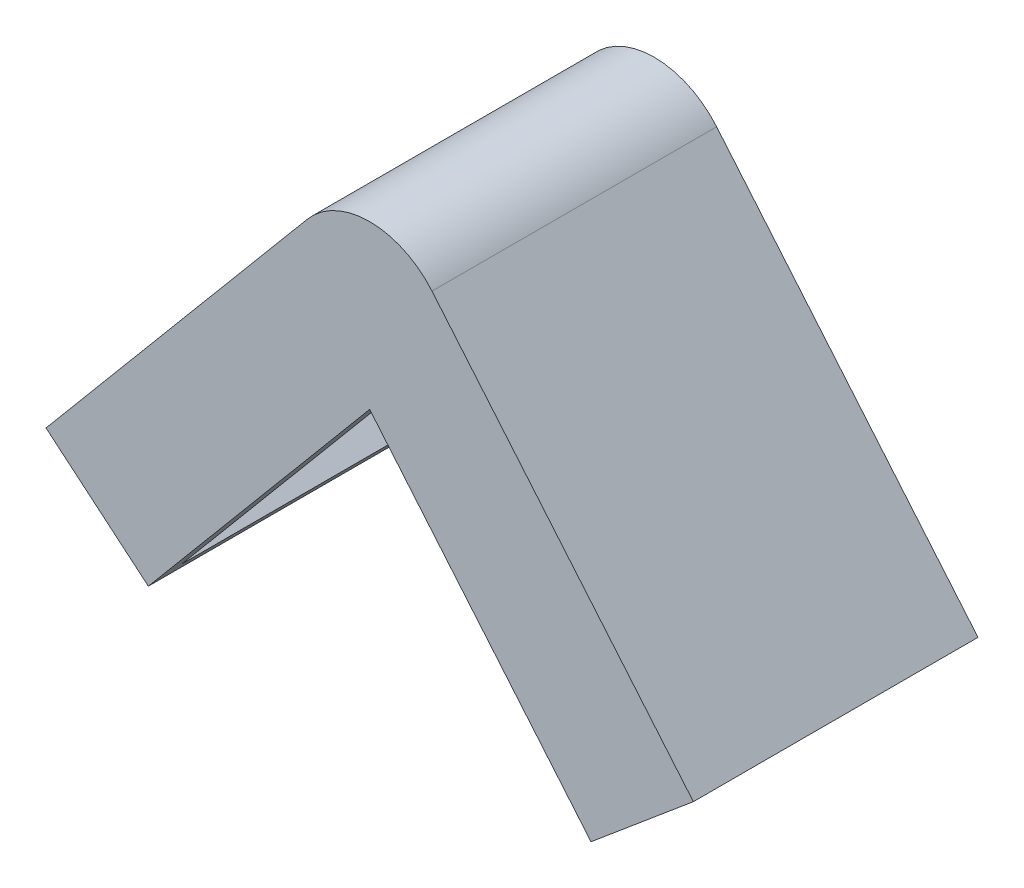
ISO-10303-21;
HEADER;
FILE_DESCRIPTION(('STEP AP214'),'2;1');
FILE_NAME('part.step','',(''),(''),'','','');
FILE_SCHEMA(('AUTOMOTIVE_DESIGN { 1 0 10303 214 1 1 1 1 }'));
ENDSEC;
DATA;
#1=APPLICATION_CONTEXT('core data for automotive mechanical design processes');
#2=APPLICATION_PROTOCOL_DEFINITION('international standard','automotive_design',2000,#1);
#3=PRODUCT_CONTEXT('',#1,'mechanical');
#4=PRODUCT('Part','Part','',(#3));
#5=PRODUCT_RELATED_PRODUCT_CATEGORY('part','',(#4));
#6=PRODUCT_DEFINITION_FORMATION('','',#4);
#7=PRODUCT_DEFINITION_CONTEXT('part definition',#1,'design');
#8=PRODUCT_DEFINITION('design','',#6,#7);
#9=PRODUCT_DEFINITION_SHAPE('','',#8);
#10=(LENGTH_UNIT() NAMED_UNIT(*) SI_UNIT(.MILLI.,.METRE.));
#11=(NAMED_UNIT(*) PLANE_ANGLE_UNIT() SI_UNIT($,.RADIAN.));
#12=(NAMED_UNIT(*) SI_UNIT($,.STERADIAN.) SOLID_ANGLE_UNIT());
#13=UNCERTAINTY_MEASURE_WITH_UNIT(LENGTH_MEASURE(1.E-05),#10,'distance_accuracy_value','');
#14=(GEOMETRIC_REPRESENTATION_CONTEXT(3) GLOBAL_UNCERTAINTY_ASSIGNED_CONTEXT((#13)) GLOBAL_UNIT_ASSIGNED_CONTEXT((#10,
#11,#12)) REPRESENTATION_CONTEXT('',''));
#15=CARTESIAN_POINT('',(0.,0.,0.));
#16=DIRECTION('',(0.,0.,1.));
#17=DIRECTION('',(1.,0.,0.));
#18=AXIS2_PLACEMENT_3D('',#15,#16,#17);
#19=CARTESIAN_POINT('',(0.,0.,88.9));
#20=DIRECTION('',(0.,0.,-1.));
#21=DIRECTION('',(-1.,0.,0.));
#22=AXIS2_PLACEMENT_3D('',#19,#20,#21);
#23=CYLINDRICAL_SURFACE('',#22,25.4);
#24=CARTESIAN_POINT('',(0.,0.,0.));
#25=DIRECTION('',(0.,0.,1.));
#26=DIRECTION('',(1.,0.,0.));
#27=AXIS2_PLACEMENT_3D('',#24,#25,#26);
#28=CIRCLE('',#27,25.4);
#29=CARTESIAN_POINT('',(19.4575288552219,16.3268052860382,0.));
#30=VERTEX_POINT('',#29);
#31=CARTESIAN_POINT('',(-19.4575288552221,16.3268052860381,0.));
#32=VERTEX_POINT('',#31);
#33=EDGE_CURVE('E137',#30,#32,#28,.T.);
#34=ORIENTED_EDGE('',*,*,#33,.T.);
#35=DIRECTION('',(0.,0.,-1.));
#36=VECTOR('',#35,1.);
#37=CARTESIAN_POINT('',(-19.4575288552221,16.3268052860381,88.9));
#38=LINE('',#37,#36);
#39=CARTESIAN_POINT('',(-19.4575288552221,16.3268052860381,88.9));
#40=VERTEX_POINT('',#39);
#41=EDGE_CURVE('E163',#40,#32,#38,.T.);
#42=ORIENTED_EDGE('',*,*,#41,.F.);
#43=CARTESIAN_POINT('',(0.,0.,88.9));
#44=DIRECTION('',(0.,0.,1.));
#45=DIRECTION('',(1.,0.,0.));
#46=AXIS2_PLACEMENT_3D('',#43,#44,#45);
#47=CIRCLE('',#46,25.4);
#48=CARTESIAN_POINT('',(19.4575288552219,16.3268052860382,88.9));
#49=VERTEX_POINT('',#48);
#50=EDGE_CURVE('E154',#49,#40,#47,.T.);
#51=ORIENTED_EDGE('',*,*,#50,.F.);
#52=DIRECTION('',(0.,0.,-1.));
#53=VECTOR('',#52,1.);
#54=CARTESIAN_POINT('',(19.4575288552219,16.3268052860382,88.9));
#55=LINE('',#54,#53);
#56=EDGE_CURVE('E57',#49,#30,#55,.T.);
#57=ORIENTED_EDGE('',*,*,#56,.T.);
#58=EDGE_LOOP('',(#34,#42,#51,#57));
#59=FACE_BOUND('',#58,.T.);
#60=ADVANCED_FACE('F35',(#59),#23,.T.);
#61=CARTESIAN_POINT('',(-19.4575288552221,16.3268052860381,88.9));
#62=DIRECTION('',(0.766044443118979,-0.642787609686538,0.));
#63=DIRECTION('',(0.642787609686538,0.766044443118979,0.));
#64=AXIS2_PLACEMENT_3D('',#61,#62,#63);
#65=PLANE('',#64);
#66=DIRECTION('',(-0.642787609686538,-0.766044443118979,0.));
#67=VECTOR('',#66,1.);
#68=CARTESIAN_POINT('',(-19.4575288552221,16.3268052860381,0.));
#69=LINE('',#68,#67);
#70=CARTESIAN_POINT('',(-101.091555285412,-80.9608389900723,0.));
#71=VERTEX_POINT('',#70);
#72=EDGE_CURVE('E139',#32,#71,#69,.T.);
#73=ORIENTED_EDGE('',*,*,#72,.T.);
#74=DIRECTION('',(0.,0.,-1.));
#75=VECTOR('',#74,1.);
#76=CARTESIAN_POINT('',(-101.091555285412,-80.9608389900723,88.9));
#77=LINE('',#76,#75);
#78=CARTESIAN_POINT('',(-101.091555285412,-80.9608389900723,88.9));
#79=VERTEX_POINT('',#78);
#80=EDGE_CURVE('E160',#79,#71,#77,.T.);
#81=ORIENTED_EDGE('',*,*,#80,.F.);
#82=DIRECTION('',(-0.642787609686538,-0.766044443118979,0.));
#83=VECTOR('',#82,1.);
#84=CARTESIAN_POINT('',(-19.4575288552221,16.3268052860381,88.9));
#85=LINE('',#84,#83);
#86=EDGE_CURVE('E94',#40,#79,#85,.T.);
#87=ORIENTED_EDGE('',*,*,#86,.F.);
#88=ORIENTED_EDGE('',*,*,#41,.T.);
#89=EDGE_LOOP('',(#73,#81,#87,#88));
#90=FACE_BOUND('',#89,.T.);
#91=ADVANCED_FACE('F222',(#90),#65,.F.);
#92=CARTESIAN_POINT('',(-81.6340264301902,-97.2876442761104,88.9));
#93=DIRECTION('',(0.642787609686537,0.76604444311898,0.));
#94=DIRECTION('',(-0.76604444311898,0.642787609686537,0.));
#95=AXIS2_PLACEMENT_3D('',#92,#93,#94);
#96=PLANE('',#95);
#97=DIRECTION('',(0.76604444311898,-0.642787609686537,0.));
#98=VECTOR('',#97,1.);
#99=CARTESIAN_POINT('',(-81.6340264301902,-97.2876442761104,0.));
#100=LINE('',#99,#98);
#101=CARTESIAN_POINT('',(-69.1269679669352,-107.78231241974,0.));
#102=VERTEX_POINT('',#101);
#103=EDGE_CURVE('E142',#71,#102,#100,.T.);
#104=ORIENTED_EDGE('',*,*,#103,.T.);
#105=DIRECTION('',(0.,0.,-1.));
#106=VECTOR('',#105,1.);
#107=CARTESIAN_POINT('',(-69.1269679669352,-107.78231241974,88.9));
#108=LINE('',#107,#106);
#109=CARTESIAN_POINT('',(-69.1269679669352,-107.78231241974,88.9));
#110=VERTEX_POINT('',#109);
#111=EDGE_CURVE('E158',#110,#102,#108,.T.);
#112=ORIENTED_EDGE('',*,*,#111,.F.);
#113=DIRECTION('',(0.76604444311898,-0.642787609686537,0.));
#114=VECTOR('',#113,1.);
#115=CARTESIAN_POINT('',(-81.6340264301902,-97.2876442761104,88.9));
#116=LINE('',#115,#114);
#117=EDGE_CURVE('E214',#79,#110,#116,.T.);
#118=ORIENTED_EDGE('',*,*,#117,.F.);
#119=ORIENTED_EDGE('',*,*,#80,.T.);
#120=EDGE_LOOP('',(#104,#112,#118,#119));
#121=FACE_BOUND('',#120,.T.);
#122=ADVANCED_FACE('F225',(#121),#96,.F.);
#123=CARTESIAN_POINT('',(12.507058463255,-10.4946681436299,88.9));
#124=DIRECTION('',(0.766044443118979,-0.642787609686538,0.));
#125=DIRECTION('',(0.642787609686538,0.76604444311898,0.));
#126=AXIS2_PLACEMENT_3D('',#123,#124,#125);
#127=PLANE('',#126);
#128=DIRECTION('',(0.,0.,-1.));
#129=VECTOR('',#128,1.);
#130=CARTESIAN_POINT('',(-65.0452666454257,-102.917930205935,88.9));
#131=LINE('',#130,#129);
#132=CARTESIAN_POINT('',(-65.0452666454257,-102.917930205935,82.55));
#133=VERTEX_POINT('',#132);
#134=CARTESIAN_POINT('',(-65.0452666454257,-102.917930205935,6.34999999999999));
#135=VERTEX_POINT('',#134);
#136=EDGE_CURVE('E11',#133,#135,#131,.T.);
#137=ORIENTED_EDGE('',*,*,#136,.F.);
#138=DIRECTION('',(-0.642787609686538,-0.766044443118979,0.));
#139=VECTOR('',#138,1.);
#140=CARTESIAN_POINT('',(12.507058463255,-10.4946681436299,82.55));
#141=LINE('',#140,#139);
#142=CARTESIAN_POINT('',(-4.08170132150951,-30.2643822138055,82.55));
#143=VERTEX_POINT('',#142);
#144=EDGE_CURVE('E42',#143,#133,#141,.T.);
#145=ORIENTED_EDGE('',*,*,#144,.F.);
#146=DIRECTION('',(0.,0.,1.));
#147=VECTOR('',#146,1.);
#148=CARTESIAN_POINT('',(-4.08170132150951,-30.2643822138055,88.9));
#149=LINE('',#148,#147);
#150=CARTESIAN_POINT('',(-4.08170132150951,-30.2643822138055,6.34999999999999));
#151=VERTEX_POINT('',#150);
#152=EDGE_CURVE('E167',#151,#143,#149,.T.);
#153=ORIENTED_EDGE('',*,*,#152,.F.);
#154=DIRECTION('',(0.642787609686538,0.766044443118979,0.));
#155=VECTOR('',#154,1.);
#156=CARTESIAN_POINT('',(12.507058463255,-10.4946681436299,6.34999999999999));
#157=LINE('',#156,#155);
#158=EDGE_CURVE('E165',#135,#151,#157,.T.);
#159=ORIENTED_EDGE('',*,*,#158,.F.);
#160=EDGE_LOOP('',(#137,#145,#153,#159));
#161=FACE_BOUND('',#160,.T.);
#162=DIRECTION('',(-0.642787609686538,-0.76604444311898,0.));
#163=VECTOR('',#162,1.);
#164=CARTESIAN_POINT('',(12.507058463255,-10.4946681436299,0.));
#165=LINE('',#164,#163);
#166=CARTESIAN_POINT('',(0.,-25.4,0.));
#167=VERTEX_POINT('',#166);
#168=EDGE_CURVE('E145',#167,#102,#165,.T.);
#169=ORIENTED_EDGE('',*,*,#168,.F.);
#170=DIRECTION('',(0.,0.,-1.));
#171=VECTOR('',#170,1.);
#172=CARTESIAN_POINT('',(0.,-25.4,88.9));
#173=LINE('',#172,#171);
#174=CARTESIAN_POINT('',(0.,-25.4,88.9));
#175=VERTEX_POINT('',#174);
#176=EDGE_CURVE('E128',#175,#167,#173,.T.);
#177=ORIENTED_EDGE('',*,*,#176,.F.);
#178=DIRECTION('',(-0.642787609686538,-0.76604444311898,0.));
#179=VECTOR('',#178,1.);
#180=CARTESIAN_POINT('',(12.507058463255,-10.4946681436299,88.9));
#181=LINE('',#180,#179);
#182=EDGE_CURVE('E117',#175,#110,#181,.T.);
#183=ORIENTED_EDGE('',*,*,#182,.T.);
#184=ORIENTED_EDGE('',*,*,#111,.T.);
#185=EDGE_LOOP('',(#169,#177,#183,#184));
#186=FACE_BOUND('',#185,.T.);
#187=ADVANCED_FACE('F192',(#161,#186),#127,.T.);
#188=CARTESIAN_POINT('',(-12.5070584632551,-10.4946681436301,88.9));
#189=DIRECTION('',(0.766044443118974,0.642787609686544,0.));
#190=DIRECTION('',(-0.642787609686544,0.766044443118974,0.));
#191=AXIS2_PLACEMENT_3D('',#188,#189,#190);
#192=PLANE('',#191);
#193=DIRECTION('',(0.642787609686544,-0.766044443118974,0.));
#194=VECTOR('',#193,1.);
#195=CARTESIAN_POINT('',(-12.5070584632551,-10.4946681436301,0.));
#196=LINE('',#195,#194);
#197=CARTESIAN_POINT('',(69.1269679669359,-107.78231241974,0.));
#198=VERTEX_POINT('',#197);
#199=EDGE_CURVE('E124',#167,#198,#196,.T.);
#200=ORIENTED_EDGE('',*,*,#199,.T.);
#201=DIRECTION('',(0.,0.,-1.));
#202=VECTOR('',#201,1.);
#203=CARTESIAN_POINT('',(69.1269679669359,-107.78231241974,88.9));
#204=LINE('',#203,#202);
#205=CARTESIAN_POINT('',(69.1269679669359,-107.78231241974,88.9));
#206=VERTEX_POINT('',#205);
#207=EDGE_CURVE('E121',#206,#198,#204,.T.);
#208=ORIENTED_EDGE('',*,*,#207,.F.);
#209=DIRECTION('',(0.642787609686544,-0.766044443118974,0.));
#210=VECTOR('',#209,1.);
#211=CARTESIAN_POINT('',(-12.5070584632551,-10.4946681436301,88.9));
#212=LINE('',#211,#210);
#213=EDGE_CURVE('E109',#175,#206,#212,.T.);
#214=ORIENTED_EDGE('',*,*,#213,.F.);
#215=ORIENTED_EDGE('',*,*,#176,.T.);
#216=EDGE_LOOP('',(#200,#208,#214,#215));
#217=FACE_BOUND('',#216,.T.);
#218=ADVANCED_FACE('F122',(#217),#192,.F.);
#219=CARTESIAN_POINT('',(81.6340264301906,-97.28764427611,88.9));
#220=DIRECTION('',(-0.642787609686541,0.766044443118977,0.));
#221=DIRECTION('',(-0.766044443118977,-0.642787609686541,0.));
#222=AXIS2_PLACEMENT_3D('',#219,#220,#221);
#223=PLANE('',#222);
#224=DIRECTION('',(0.766044443118977,0.642787609686541,0.));
#225=VECTOR('',#224,1.);
#226=CARTESIAN_POINT('',(81.6340264301906,-97.28764427611,0.));
#227=LINE('',#226,#225);
#228=CARTESIAN_POINT('',(101.091555285413,-80.9608389900715,0.));
#229=VERTEX_POINT('',#228);
#230=EDGE_CURVE('E149',#198,#229,#227,.T.);
#231=ORIENTED_EDGE('',*,*,#230,.T.);
#232=DIRECTION('',(0.,0.,-1.));
#233=VECTOR('',#232,1.);
#234=CARTESIAN_POINT('',(101.091555285413,-80.9608389900715,88.9));
#235=LINE('',#234,#233);
#236=CARTESIAN_POINT('',(101.091555285413,-80.9608389900715,88.9));
#237=VERTEX_POINT('',#236);
#238=EDGE_CURVE('E129',#237,#229,#235,.T.);
#239=ORIENTED_EDGE('',*,*,#238,.F.);
#240=DIRECTION('',(0.766044443118977,0.642787609686541,0.));
#241=VECTOR('',#240,1.);
#242=CARTESIAN_POINT('',(81.6340264301906,-97.28764427611,88.9));
#243=LINE('',#242,#241);
#244=EDGE_CURVE('E114',#206,#237,#243,.T.);
#245=ORIENTED_EDGE('',*,*,#244,.F.);
#246=ORIENTED_EDGE('',*,*,#207,.T.);
#247=EDGE_LOOP('',(#231,#239,#245,#246));
#248=FACE_BOUND('',#247,.T.);
#249=ADVANCED_FACE('F131',(#248),#223,.F.);
#250=CARTESIAN_POINT('',(19.4575288552219,16.3268052860382,88.9));
#251=DIRECTION('',(0.766044443118974,0.642787609686544,0.));
#252=DIRECTION('',(-0.642787609686544,0.766044443118974,0.));
#253=AXIS2_PLACEMENT_3D('',#250,#251,#252);
#254=PLANE('',#253);
#255=DIRECTION('',(0.642787609686544,-0.766044443118974,0.));
#256=VECTOR('',#255,1.);
#257=CARTESIAN_POINT('',(19.4575288552219,16.3268052860382,0.));
#258=LINE('',#257,#256);
#259=EDGE_CURVE('E151',#30,#229,#258,.T.);
#260=ORIENTED_EDGE('',*,*,#259,.F.);
#261=ORIENTED_EDGE('',*,*,#56,.F.);
#262=DIRECTION('',(0.642787609686544,-0.766044443118974,0.));
#263=VECTOR('',#262,1.);
#264=CARTESIAN_POINT('',(19.4575288552219,16.3268052860382,88.9));
#265=LINE('',#264,#263);
#266=EDGE_CURVE('E132',#49,#237,#265,.T.);
#267=ORIENTED_EDGE('',*,*,#266,.T.);
#268=ORIENTED_EDGE('',*,*,#238,.T.);
#269=EDGE_LOOP('',(#260,#261,#267,#268));
#270=FACE_BOUND('',#269,.T.);
#271=ADVANCED_FACE('F220',(#270),#254,.T.);
#272=CARTESIAN_POINT('',(0.,0.,88.9));
#273=DIRECTION('',(0.,0.,1.));
#274=DIRECTION('',(1.,0.,0.));
#275=AXIS2_PLACEMENT_3D('',#272,#273,#274);
#276=PLANE('',#275);
#277=ORIENTED_EDGE('',*,*,#50,.T.);
#278=ORIENTED_EDGE('',*,*,#86,.T.);
#279=ORIENTED_EDGE('',*,*,#117,.T.);
#280=ORIENTED_EDGE('',*,*,#182,.F.);
#281=ORIENTED_EDGE('',*,*,#213,.T.);
#282=ORIENTED_EDGE('',*,*,#244,.T.);
#283=ORIENTED_EDGE('',*,*,#266,.F.);
#284=EDGE_LOOP('',(#277,#278,#279,#280,#281,#282,#283));
#285=FACE_BOUND('',#284,.T.);
#286=ADVANCED_FACE('F111',(#285),#276,.T.);
#287=CARTESIAN_POINT('',(0.,0.,0.));
#288=DIRECTION('',(0.,0.,1.));
#289=DIRECTION('',(1.,0.,0.));
#290=AXIS2_PLACEMENT_3D('',#287,#288,#289);
#291=PLANE('',#290);
#292=ORIENTED_EDGE('',*,*,#33,.F.);
#293=ORIENTED_EDGE('',*,*,#259,.T.);
#294=ORIENTED_EDGE('',*,*,#230,.F.);
#295=ORIENTED_EDGE('',*,*,#199,.F.);
#296=ORIENTED_EDGE('',*,*,#168,.T.);
#297=ORIENTED_EDGE('',*,*,#103,.F.);
#298=ORIENTED_EDGE('',*,*,#72,.F.);
#299=EDGE_LOOP('',(#292,#293,#294,#295,#296,#297,#298));
#300=FACE_BOUND('',#299,.T.);
#301=ADVANCED_FACE('F218',(#300),#291,.F.);
#302=CARTESIAN_POINT('',(-93.0641081969456,-79.4073305940399,6.34999999999999));
#303=DIRECTION('',(-0.642787609686538,-0.766044443118979,0.));
#304=DIRECTION('',(0.766044443118979,-0.642787609686538,0.));
#305=AXIS2_PLACEMENT_3D('',#302,#303,#304);
#306=PLANE('',#305);
#307=ORIENTED_EDGE('',*,*,#136,.T.);
#308=DIRECTION('',(0.766044443118979,-0.642787609686538,0.));
#309=VECTOR('',#308,1.);
#310=CARTESIAN_POINT('',(-93.0641081969456,-79.4073305940399,6.34999999999999));
#311=LINE('',#310,#309);
#312=CARTESIAN_POINT('',(-93.0641081969456,-79.4073305940399,6.34999999999999));
#313=VERTEX_POINT('',#312);
#314=EDGE_CURVE('E49',#313,#135,#311,.T.);
#315=ORIENTED_EDGE('',*,*,#314,.F.);
#316=DIRECTION('',(0.,0.,-1.));
#317=VECTOR('',#316,1.);
#318=CARTESIAN_POINT('',(-93.0641081969456,-79.4073305940399,6.34999999999999));
#319=LINE('',#318,#317);
#320=CARTESIAN_POINT('',(-93.0641081969456,-79.4073305940399,82.55));
#321=VERTEX_POINT('',#320);
#322=EDGE_CURVE('E189',#321,#313,#319,.T.);
#323=ORIENTED_EDGE('',*,*,#322,.F.);
#324=DIRECTION('',(0.766044443118979,-0.642787609686538,0.));
#325=VECTOR('',#324,1.);
#326=CARTESIAN_POINT('',(-93.0641081969456,-79.4073305940399,82.55));
#327=LINE('',#326,#325);
#328=EDGE_CURVE('E140',#321,#133,#327,.T.);
#329=ORIENTED_EDGE('',*,*,#328,.T.);
#330=EDGE_LOOP('',(#307,#315,#323,#329));
#331=FACE_BOUND('',#330,.T.);
#332=ADVANCED_FACE('F186',(#331),#306,.F.);
#333=CARTESIAN_POINT('',(-93.0641081969456,-79.4073305940399,82.55));
#334=DIRECTION('',(0.,0.,1.));
#335=DIRECTION('',(1.,0.,0.));
#336=AXIS2_PLACEMENT_3D('',#333,#334,#335);
#337=PLANE('',#336);
#338=ORIENTED_EDGE('',*,*,#144,.T.);
#339=ORIENTED_EDGE('',*,*,#328,.F.);
#340=DIRECTION('',(-0.642787609686538,-0.766044443118979,0.));
#341=VECTOR('',#340,1.);
#342=CARTESIAN_POINT('',(-93.0641081969456,-79.4073305940399,82.55));
#343=LINE('',#342,#341);
#344=CARTESIAN_POINT('',(-32.1005428730293,-6.75378260191069,82.55));
#345=VERTEX_POINT('',#344);
#346=EDGE_CURVE('E209',#345,#321,#343,.T.);
#347=ORIENTED_EDGE('',*,*,#346,.F.);
#348=DIRECTION('',(0.766044443118979,-0.642787609686538,0.));
#349=VECTOR('',#348,1.);
#350=CARTESIAN_POINT('',(-32.1005428730293,-6.75378260191069,82.55));
#351=LINE('',#350,#349);
#352=EDGE_CURVE('E181',#345,#143,#351,.T.);
#353=ORIENTED_EDGE('',*,*,#352,.T.);
#354=EDGE_LOOP('',(#338,#339,#347,#353));
#355=FACE_BOUND('',#354,.T.);
#356=ADVANCED_FACE('F175',(#355),#337,.F.);
#357=CARTESIAN_POINT('',(-32.1005428730293,-6.75378260191069,82.55));
#358=DIRECTION('',(0.642787609686538,0.766044443118979,0.));
#359=DIRECTION('',(-0.766044443118979,0.642787609686538,0.));
#360=AXIS2_PLACEMENT_3D('',#357,#358,#359);
#361=PLANE('',#360);
#362=ORIENTED_EDGE('',*,*,#152,.T.);
#363=ORIENTED_EDGE('',*,*,#352,.F.);
#364=DIRECTION('',(0.,0.,1.));
#365=VECTOR('',#364,1.);
#366=CARTESIAN_POINT('',(-32.1005428730293,-6.75378260191069,82.55));
#367=LINE('',#366,#365);
#368=CARTESIAN_POINT('',(-32.1005428730293,-6.75378260191069,6.34999999999999));
#369=VERTEX_POINT('',#368);
#370=EDGE_CURVE('E205',#369,#345,#367,.T.);
#371=ORIENTED_EDGE('',*,*,#370,.F.);
#372=DIRECTION('',(0.766044443118979,-0.642787609686538,0.));
#373=VECTOR('',#372,1.);
#374=CARTESIAN_POINT('',(-32.1005428730293,-6.75378260191069,6.34999999999999));
#375=LINE('',#374,#373);
#376=EDGE_CURVE('E199',#369,#151,#375,.T.);
#377=ORIENTED_EDGE('',*,*,#376,.T.);
#378=EDGE_LOOP('',(#362,#363,#371,#377));
#379=FACE_BOUND('',#378,.T.);
#380=ADVANCED_FACE('F203',(#379),#361,.F.);
#381=CARTESIAN_POINT('',(-32.1005428730293,-6.75378260191069,6.34999999999999));
#382=DIRECTION('',(0.,0.,-1.));
#383=DIRECTION('',(-1.,0.,0.));
#384=AXIS2_PLACEMENT_3D('',#381,#382,#383);
#385=PLANE('',#384);
#386=ORIENTED_EDGE('',*,*,#158,.T.);
#387=ORIENTED_EDGE('',*,*,#376,.F.);
#388=DIRECTION('',(0.642787609686538,0.766044443118979,0.));
#389=VECTOR('',#388,1.);
#390=CARTESIAN_POINT('',(-32.1005428730293,-6.75378260191069,6.34999999999999));
#391=LINE('',#390,#389);
#392=EDGE_CURVE('E341',#313,#369,#391,.T.);
#393=ORIENTED_EDGE('',*,*,#392,.F.);
#394=ORIENTED_EDGE('',*,*,#314,.T.);
#395=EDGE_LOOP('',(#386,#387,#393,#394));
#396=FACE_BOUND('',#395,.T.);
#397=ADVANCED_FACE('F197',(#396),#385,.F.);
#398=CARTESIAN_POINT('',(-15.5117830882648,13.0159314682649,0.));
#399=DIRECTION('',(-0.766044443118979,0.642787609686538,0.));
#400=DIRECTION('',(-0.642787609686538,-0.766044443118979,0.));
#401=AXIS2_PLACEMENT_3D('',#398,#399,#400);
#402=PLANE('',#401);
#403=ORIENTED_EDGE('',*,*,#322,.T.);
#404=ORIENTED_EDGE('',*,*,#392,.T.);
#405=ORIENTED_EDGE('',*,*,#370,.T.);
#406=ORIENTED_EDGE('',*,*,#346,.T.);
#407=EDGE_LOOP('',(#403,#404,#405,#406));
#408=FACE_BOUND('',#407,.T.);
#409=ADVANCED_FACE('F327',(#408),#402,.F.);
#410=CLOSED_SHELL('',(#60,#91,#122,#187,#218,#249,#271,#286,#301,#332,#356,#380,#397,#409));
#411=MANIFOLD_SOLID_BREP('B2',#410);
#412=ADVANCED_BREP_SHAPE_REPRESENTATION('',(#18,#411),#14);
#413=SHAPE_DEFINITION_REPRESENTATION(#9,#412);
ENDSEC;
END-ISO-10303-21;
